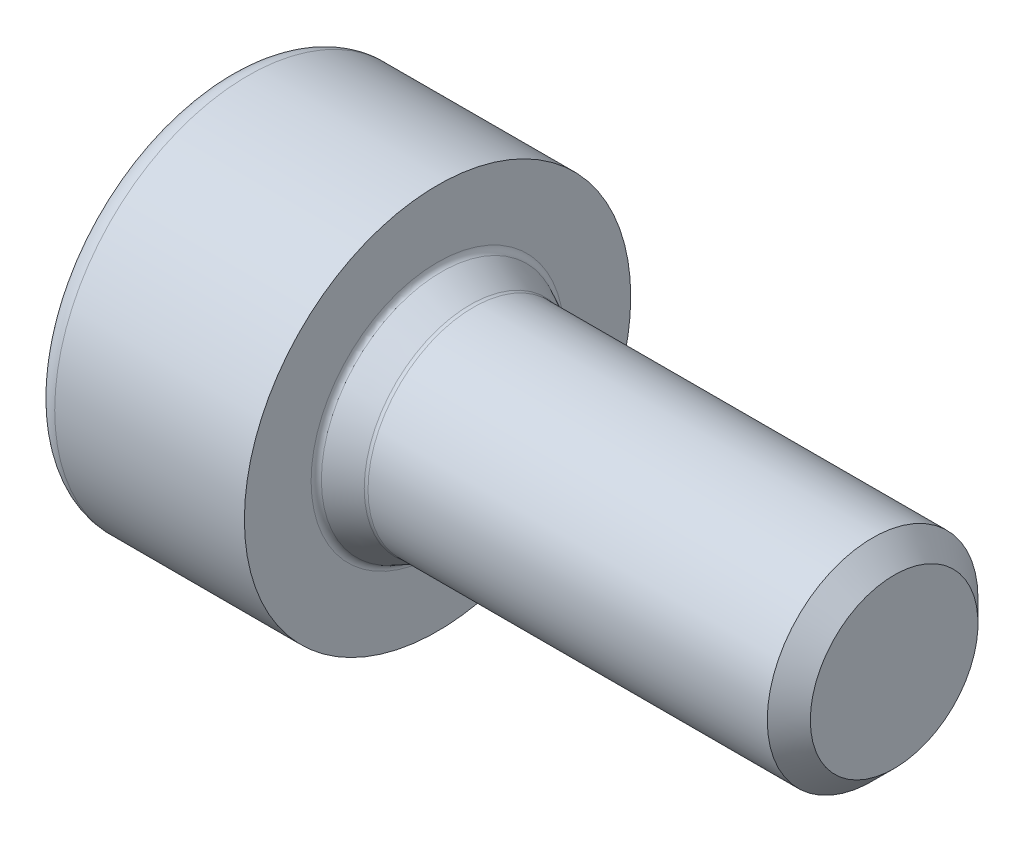
ISO-10303-21;
HEADER;
FILE_DESCRIPTION(('STEP AP214'),'2;1');
FILE_NAME('part.step','',(''),(''),'','','');
FILE_SCHEMA(('AUTOMOTIVE_DESIGN { 1 0 10303 214 1 1 1 1 }'));
ENDSEC;
DATA;
#1=APPLICATION_CONTEXT('core data for automotive mechanical design processes');
#2=APPLICATION_PROTOCOL_DEFINITION('international standard','automotive_design',2000,#1);
#3=PRODUCT_CONTEXT('',#1,'mechanical');
#4=PRODUCT('Part','Part','',(#3));
#5=PRODUCT_RELATED_PRODUCT_CATEGORY('part','',(#4));
#6=PRODUCT_DEFINITION_FORMATION('','',#4);
#7=PRODUCT_DEFINITION_CONTEXT('part definition',#1,'design');
#8=PRODUCT_DEFINITION('design','',#6,#7);
#9=PRODUCT_DEFINITION_SHAPE('','',#8);
#10=(LENGTH_UNIT() NAMED_UNIT(*) SI_UNIT(.MILLI.,.METRE.));
#11=(NAMED_UNIT(*) PLANE_ANGLE_UNIT() SI_UNIT($,.RADIAN.));
#12=(NAMED_UNIT(*) SI_UNIT($,.STERADIAN.) SOLID_ANGLE_UNIT());
#13=UNCERTAINTY_MEASURE_WITH_UNIT(LENGTH_MEASURE(1.E-05),#10,'distance_accuracy_value','');
#14=(GEOMETRIC_REPRESENTATION_CONTEXT(3) GLOBAL_UNCERTAINTY_ASSIGNED_CONTEXT((#13)) GLOBAL_UNIT_ASSIGNED_CONTEXT((#10,
#11,#12)) REPRESENTATION_CONTEXT('',''));
#15=CARTESIAN_POINT('',(0.,0.,0.));
#16=DIRECTION('',(0.,0.,1.));
#17=DIRECTION('',(1.,0.,0.));
#18=AXIS2_PLACEMENT_3D('',#15,#16,#17);
#19=CARTESIAN_POINT('',(-12.3555753520479,407.524390512293,-362.357299098567));
#20=DIRECTION('',(1.,0.,0.));
#21=DIRECTION('',(0.,0.,-1.));
#22=AXIS2_PLACEMENT_3D('',#19,#20,#21);
#23=PLANE('',#22);
#24=DIRECTION('',(0.,-0.001436357737181,0.999998968437693));
#25=VECTOR('',#24,1.);
#26=CARTESIAN_POINT('',(-12.355575352048,408.775425824748,-363.077190743416));
#27=LINE('',#26,#25);
#28=CARTESIAN_POINT('',(-12.3555753524209,408.774389222609,-362.355503651395));
#29=VERTEX_POINT('',#28);
#30=CARTESIAN_POINT('',(-12.3555753520479,408.775425824748,-363.077190743416));
#31=VERTEX_POINT('',#30);
#32=EDGE_CURVE('E164',#29,#31,#27,.F.);
#33=ORIENTED_EDGE('',*,*,#32,.T.);
#34=DIRECTION('',(0.,0.865306331556685,0.501243406508168));
#35=VECTOR('',#34,1.);
#36=CARTESIAN_POINT('',(-12.3555753520479,407.526463716109,-363.800673282609));
#37=LINE('',#36,#35);
#38=CARTESIAN_POINT('',(-12.3555753524207,408.150944770312,-363.438932012813));
#39=VERTEX_POINT('',#38);
#40=EDGE_CURVE('E160',#31,#39,#37,.F.);
#41=ORIENTED_EDGE('',*,*,#40,.T.);
#42=CARTESIAN_POINT('',(-12.3555753527938,407.524390512293,-362.357299098567));
#43=DIRECTION('',(-1.,0.,-2.16481306494449E-13));
#44=DIRECTION('',(-2.16481306494449E-13,0.,1.));
#45=AXIS2_PLACEMENT_3D('',#42,#43,#44);
#46=CIRCLE('',#45,1.24999999953735);
#47=EDGE_CURVE('E161',#39,#29,#46,.F.);
#48=ORIENTED_EDGE('',*,*,#47,.T.);
#49=EDGE_LOOP('',(#33,#41,#48));
#50=FACE_BOUND('',#49,.T.);
#51=ADVANCED_FACE('F17',(#50),#23,.F.);
#52=CARTESIAN_POINT('',(-12.3555753520479,407.524390512293,-362.357299098567));
#53=DIRECTION('',(1.,0.,0.));
#54=DIRECTION('',(0.,0.,-1.));
#55=AXIS2_PLACEMENT_3D('',#52,#53,#54);
#56=PLANE('',#55);
#57=DIRECTION('',(0.,-0.866742689293866,0.498755561929526));
#58=VECTOR('',#57,1.);
#59=CARTESIAN_POINT('',(-12.355575352048,408.773352620932,-361.633816559374));
#60=LINE('',#59,#58);
#61=CARTESIAN_POINT('',(-12.355575352421,408.147834964589,-361.27387073715));
#62=VERTEX_POINT('',#61);
#63=CARTESIAN_POINT('',(-12.355575352048,408.773352620932,-361.633816559374));
#64=VERTEX_POINT('',#63);
#65=EDGE_CURVE('E524',#62,#64,#60,.F.);
#66=ORIENTED_EDGE('',*,*,#65,.T.);
#67=DIRECTION('',(0.,-0.001436357737181,0.999998968437693));
#68=VECTOR('',#67,1.);
#69=CARTESIAN_POINT('',(-12.355575352048,408.775425824748,-363.077190743416));
#70=LINE('',#69,#68);
#71=EDGE_CURVE('E552',#64,#29,#70,.F.);
#72=ORIENTED_EDGE('',*,*,#71,.T.);
#73=CARTESIAN_POINT('',(-12.3555753527938,407.524390512293,-362.357299098567));
#74=DIRECTION('',(-1.,0.,-2.16481306494449E-13));
#75=DIRECTION('',(-2.16481306494449E-13,0.,1.));
#76=AXIS2_PLACEMENT_3D('',#73,#74,#75);
#77=CIRCLE('',#76,1.2499999995374);
#78=EDGE_CURVE('E179',#62,#29,#77,.T.);
#79=ORIENTED_EDGE('',*,*,#78,.F.);
#80=EDGE_LOOP('',(#66,#72,#79));
#81=FACE_BOUND('',#80,.T.);
#82=ADVANCED_FACE('F756',(#81),#56,.F.);
#83=CARTESIAN_POINT('',(-12.3555753520479,408.775425824748,-363.077190743416));
#84=DIRECTION('',(0.,0.999998968437693,0.001436357737181));
#85=DIRECTION('',(0.,-0.001436357737181,0.999998968437693));
#86=AXIS2_PLACEMENT_3D('',#83,#84,#85);
#87=PLANE('',#86);
#88=DIRECTION('',(0.,-0.001436357737181,0.999998968437693));
#89=VECTOR('',#88,1.);
#90=CARTESIAN_POINT('',(-14.2055753520479,408.775425824748,-363.077190743416));
#91=LINE('',#90,#89);
#92=CARTESIAN_POINT('',(-14.2055753520479,408.775425824748,-363.077190743416));
#93=VERTEX_POINT('',#92);
#94=CARTESIAN_POINT('',(-14.205575352099,408.77540154939,-363.060290126061));
#95=VERTEX_POINT('',#94);
#96=EDGE_CURVE('E428',#93,#95,#91,.T.);
#97=ORIENTED_EDGE('',*,*,#96,.F.);
#98=DIRECTION('',(1.,0.,0.));
#99=VECTOR('',#98,1.);
#100=CARTESIAN_POINT('',(-12.3555753520479,408.775425824748,-363.077190743417));
#101=LINE('',#100,#99);
#102=EDGE_CURVE('E169',#93,#31,#101,.T.);
#103=ORIENTED_EDGE('',*,*,#102,.T.);
#104=ORIENTED_EDGE('',*,*,#32,.F.);
#105=ORIENTED_EDGE('',*,*,#71,.F.);
#106=DIRECTION('',(1.,0.,0.));
#107=VECTOR('',#106,1.);
#108=CARTESIAN_POINT('',(-12.355575352048,408.773352620932,-361.633816559374));
#109=LINE('',#108,#107);
#110=CARTESIAN_POINT('',(-14.2055753520479,408.773352620932,-361.633816559374));
#111=VERTEX_POINT('',#110);
#112=EDGE_CURVE('E514',#64,#111,#109,.F.);
#113=ORIENTED_EDGE('',*,*,#112,.T.);
#114=DIRECTION('',(0.,-0.001436357737181,0.999998968437693));
#115=VECTOR('',#114,1.);
#116=CARTESIAN_POINT('',(-14.2055753520478,408.775425824748,-363.077190743416));
#117=LINE('',#116,#115);
#118=CARTESIAN_POINT('',(-14.2055753521657,408.77337689629,-361.650717176594));
#119=VERTEX_POINT('',#118);
#120=EDGE_CURVE('E182',#119,#111,#117,.T.);
#121=ORIENTED_EDGE('',*,*,#120,.F.);
#122=CARTESIAN_POINT('',(-14.2055753521713,408.775401549413,-363.060290126233));
#123=CARTESIAN_POINT('',(-14.1818605668288,408.775332139449,-363.011966594605));
#124=CARTESIAN_POINT('',(-14.1595698837865,408.775261589849,-362.962849637471));
#125=CARTESIAN_POINT('',(-14.1187835332441,408.775117785222,-362.862732187342));
#126=CARTESIAN_POINT('',(-14.1003115832626,408.775044516436,-362.811722115235));
#127=CARTESIAN_POINT('',(-14.068482341237,408.774895967497,-362.708301649208));
#128=CARTESIAN_POINT('',(-14.0551059144334,408.774820696028,-362.655897300804));
#129=CARTESIAN_POINT('',(-14.0345556307625,408.774668576383,-362.549990893299));
#130=CARTESIAN_POINT('',(-14.0273635917321,408.774591733514,-362.49649252872));
#131=CARTESIAN_POINT('',(-14.0226061400785,408.774493727523,-362.42826029993));
#132=CARTESIAN_POINT('',(-14.021845453552,408.774472836964,-362.413716195228));
#133=CARTESIAN_POINT('',(-14.0208299372647,408.774431039519,-362.384616618899));
#134=CARTESIAN_POINT('',(-14.0205748780482,408.774410132645,-362.370061155427));
#135=CARTESIAN_POINT('',(-14.02057658657,408.774334730605,-362.317565902896));
#136=CARTESIAN_POINT('',(-14.0223132879634,408.774280218465,-362.279614295819));
#137=CARTESIAN_POINT('',(-14.0291569958457,408.774171619546,-362.20400722139));
#138=CARTESIAN_POINT('',(-14.0342663783348,408.774117533096,-362.166351981762));
#139=CARTESIAN_POINT('',(-14.054330819617,408.773956017387,-362.053903990394));
#140=CARTESIAN_POINT('',(-14.0740189447518,408.773849763539,-361.979929564883));
#141=CARTESIAN_POINT('',(-14.1132845540777,408.773682446437,-361.863442616683));
#142=CARTESIAN_POINT('',(-14.1299375139902,408.773619853772,-361.819865310994));
#143=CARTESIAN_POINT('',(-14.1659144314126,408.773496893351,-361.73425969142));
#144=CARTESIAN_POINT('',(-14.1852142365639,408.77343651111,-361.692221292679));
#145=CARTESIAN_POINT('',(-14.205575352182,408.77337689629,-361.650717176561));
#146=B_SPLINE_CURVE_WITH_KNOTS('',3,(#122,#123,#124,#125,#126,#127,#128,#129,#130,#131,#132,
#133,#134,#135,#136,#137,#138,#139,#140,#141,#142,#143,#144,#145),.UNSPECIFIED.,.F.,.F.,(4,2,2,
2,2,2,2,2,2,2,2,4),(0.,0.161592976161006,0.324161275105769,0.486112932388837,0.647586806093457,
0.691272786497746,0.734938937486733,0.848735605551864,0.962612527238233,1.1912562517991,
1.33113310606137,1.46980937846824),.UNSPECIFIED.);
#147=EDGE_CURVE('E423',#95,#119,#146,.T.);
#148=ORIENTED_EDGE('',*,*,#147,.F.);
#149=EDGE_LOOP('',(#97,#103,#104,#105,#113,#121,#148));
#150=FACE_BOUND('',#149,.T.);
#151=ADVANCED_FACE('F414',(#150),#87,.F.);
#152=CARTESIAN_POINT('',(-12.3555753520479,407.526463716109,-363.800673282609));
#153=DIRECTION('',(0.,0.501243406508168,-0.865306331556685));
#154=DIRECTION('',(0.,0.865306331556685,0.501243406508168));
#155=AXIS2_PLACEMENT_3D('',#152,#153,#154);
#156=PLANE('',#155);
#157=DIRECTION('',(1.,0.,0.));
#158=VECTOR('',#157,1.);
#159=CARTESIAN_POINT('',(-12.355575352048,407.526463716109,-363.800673282609));
#160=LINE('',#159,#158);
#161=CARTESIAN_POINT('',(-14.2055753520479,407.526463716109,-363.800673282609));
#162=VERTEX_POINT('',#161);
#163=CARTESIAN_POINT('',(-12.3555753520479,407.526463716109,-363.800673282609));
#164=VERTEX_POINT('',#163);
#165=EDGE_CURVE('E174',#162,#164,#160,.T.);
#166=ORIENTED_EDGE('',*,*,#165,.T.);
#167=DIRECTION('',(0.,0.865306331556624,0.501243406508274));
#168=VECTOR('',#167,1.);
#169=CARTESIAN_POINT('',(-12.3555753520479,407.526463716109,-363.800673282609));
#170=LINE('',#169,#168);
#171=EDGE_CURVE('E148',#164,#39,#170,.T.);
#172=ORIENTED_EDGE('',*,*,#171,.T.);
#173=ORIENTED_EDGE('',*,*,#40,.F.);
#174=ORIENTED_EDGE('',*,*,#102,.F.);
#175=DIRECTION('',(0.,0.865306331556685,0.501243406508168));
#176=VECTOR('',#175,1.);
#177=CARTESIAN_POINT('',(-14.2055753520479,407.526463716109,-363.800673282609));
#178=LINE('',#177,#176);
#179=CARTESIAN_POINT('',(-14.2055753521656,408.760801598575,-363.085662075102));
#180=VERTEX_POINT('',#179);
#181=EDGE_CURVE('E422',#180,#93,#178,.T.);
#182=ORIENTED_EDGE('',*,*,#181,.F.);
#183=CARTESIAN_POINT('',(-14.2055753521713,407.541087942261,-363.792201950961));
#184=CARTESIAN_POINT('',(-14.1818605668282,407.582902643271,-363.767980074354));
#185=CARTESIAN_POINT('',(-14.1595698837854,407.625403901106,-363.743360498041));
#186=CARTESIAN_POINT('',(-14.1187835332425,407.712036253968,-363.693177234515));
#187=CARTESIAN_POINT('',(-14.1003115832609,407.756175637869,-363.667608745831));
#188=CARTESIAN_POINT('',(-14.0684823412355,407.845666114251,-363.615769865664));
#189=CARTESIAN_POINT('',(-14.055105914432,407.891011975502,-363.589502504458));
#190=CARTESIAN_POINT('',(-14.0345556307625,407.982653555001,-363.536417561227));
#191=CARTESIAN_POINT('',(-14.0273635917332,408.02894607635,-363.50960183106));
#192=CARTESIAN_POINT('',(-14.0226061400779,408.087987916845,-363.475400840991));
#193=CARTESIAN_POINT('',(-14.0218454535508,408.100573035713,-363.468110696887));
#194=CARTESIAN_POINT('',(-14.0208299372654,408.125753109329,-363.453524711069));
#195=CARTESIAN_POINT('',(-14.0205748780513,408.13834805702,-363.446228873444));
#196=CARTESIAN_POINT('',(-14.0205765865773,408.183772578265,-363.419915947088));
#197=CARTESIAN_POINT('',(-14.0223132879652,408.216612378045,-363.400892934662));
#198=CARTESIAN_POINT('',(-14.0291569958435,408.282035725752,-363.362995348034));
#199=CARTESIAN_POINT('',(-14.0342663783339,408.314619076628,-363.344120887977));
#200=CARTESIAN_POINT('',(-14.0543308196182,408.4119211359,-363.287757015582));
#201=CARTESIAN_POINT('',(-14.0740189447517,408.4759317407,-363.250677784297));
#202=CARTESIAN_POINT('',(-14.1132845540769,408.5767287385,-363.192289409337));
#203=CARTESIAN_POINT('',(-14.1299375139895,408.614436495922,-363.170446549655));
#204=CARTESIAN_POINT('',(-14.1659144314122,408.68851165697,-363.127537253019));
#205=CARTESIAN_POINT('',(-14.1852142365639,408.724887787094,-363.106465761093));
#206=CARTESIAN_POINT('',(-14.205575352182,408.760801598604,-363.085662075086));
#207=B_SPLINE_CURVE_WITH_KNOTS('',3,(#183,#184,#185,#186,#187,#188,#189,#190,#191,#192,#193,
#194,#195,#196,#197,#198,#199,#200,#201,#202,#203,#204,#205,#206),.UNSPECIFIED.,.F.,.F.,(4,2,2,
2,2,2,2,2,2,2,2,4),(0.,0.161592976164444,0.324161275111491,0.48611293239164,0.64758680609382,
0.69127278649784,0.734938937486526,0.848735605552501,0.962612527238676,1.19125625179824,
1.33113310606072,1.46980937846929),.UNSPECIFIED.);
#208=CARTESIAN_POINT('',(-14.2055753520988,407.541087942399,-363.792201950855));
#209=VERTEX_POINT('',#208);
#210=EDGE_CURVE('E417',#209,#180,#207,.T.);
#211=ORIENTED_EDGE('',*,*,#210,.F.);
#212=DIRECTION('',(0.,0.865306331556685,0.501243406508168));
#213=VECTOR('',#212,1.);
#214=CARTESIAN_POINT('',(-14.2055753520478,407.526463716109,-363.800673282609));
#215=LINE('',#214,#213);
#216=EDGE_CURVE('E168',#162,#209,#215,.T.);
#217=ORIENTED_EDGE('',*,*,#216,.F.);
#218=EDGE_LOOP('',(#166,#172,#173,#174,#182,#211,#217));
#219=FACE_BOUND('',#218,.T.);
#220=ADVANCED_FACE('F171',(#219),#156,.F.);
#221=CARTESIAN_POINT('',(-12.3555753520479,407.524390512293,-362.357299098567));
#222=DIRECTION('',(1.,0.,0.));
#223=DIRECTION('',(0.,0.,-1.));
#224=AXIS2_PLACEMENT_3D('',#221,#222,#223);
#225=PLANE('',#224);
#226=ORIENTED_EDGE('',*,*,#171,.F.);
#227=DIRECTION('',(0.,0.866742689293866,-0.498755561929526));
#228=VECTOR('',#227,1.);
#229=CARTESIAN_POINT('',(-12.3555753520479,406.275428403654,-363.080781637759));
#230=LINE('',#229,#228);
#231=CARTESIAN_POINT('',(-12.3555753524207,406.900946059996,-363.440727459983));
#232=VERTEX_POINT('',#231);
#233=EDGE_CURVE('E150',#164,#232,#230,.F.);
#234=ORIENTED_EDGE('',*,*,#233,.T.);
#235=CARTESIAN_POINT('',(-12.3555753527938,407.524390512293,-362.357299098567));
#236=DIRECTION('',(-1.,0.,-2.16481306494449E-13));
#237=DIRECTION('',(-2.16481306494449E-13,0.,1.));
#238=AXIS2_PLACEMENT_3D('',#235,#236,#237);
#239=CIRCLE('',#238,1.24999999953734);
#240=EDGE_CURVE('E144',#232,#39,#239,.F.);
#241=ORIENTED_EDGE('',*,*,#240,.T.);
#242=EDGE_LOOP('',(#226,#234,#241));
#243=FACE_BOUND('',#242,.T.);
#244=ADVANCED_FACE('F146',(#243),#225,.F.);
#245=CARTESIAN_POINT('',(-12.3555753527282,407.524390512293,-362.357299098567));
#246=DIRECTION('',(-1.,0.,-2.16481306494449E-13));
#247=DIRECTION('',(-2.16481306494449E-13,0.,1.));
#248=AXIS2_PLACEMENT_3D('',#245,#246,#247);
#249=CONICAL_SURFACE('',#248,1.24999999942377,1.04719754973717);
#250=CARTESIAN_POINT('',(-12.3555753527938,407.524390512293,-362.357299098567));
#251=DIRECTION('',(-1.,0.,-2.16481306494449E-13));
#252=DIRECTION('',(-2.16481306494449E-13,0.,1.));
#253=AXIS2_PLACEMENT_3D('',#250,#251,#252);
#254=CIRCLE('',#253,1.24999999953746);
#255=CARTESIAN_POINT('',(-12.355575352421,406.897836254274,-361.275666184321));
#256=VERTEX_POINT('',#255);
#257=EDGE_CURVE('E155',#256,#62,#254,.T.);
#258=ORIENTED_EDGE('',*,*,#257,.T.);
#259=ORIENTED_EDGE('',*,*,#78,.T.);
#260=ORIENTED_EDGE('',*,*,#47,.F.);
#261=ORIENTED_EDGE('',*,*,#240,.F.);
#262=CARTESIAN_POINT('',(-12.3555753527938,407.524390512293,-362.357299098567));
#263=DIRECTION('',(-1.,0.,-2.16481306494449E-13));
#264=DIRECTION('',(-2.16481306494449E-13,0.,1.));
#265=AXIS2_PLACEMENT_3D('',#262,#263,#264);
#266=CIRCLE('',#265,1.2499999995374);
#267=CARTESIAN_POINT('',(-12.3555753524209,406.274391801977,-362.359094545738));
#268=VERTEX_POINT('',#267);
#269=EDGE_CURVE('E382',#232,#268,#266,.T.);
#270=ORIENTED_EDGE('',*,*,#269,.T.);
#271=CARTESIAN_POINT('',(-12.3555753527938,407.524390512293,-362.357299098567));
#272=DIRECTION('',(-1.,0.,-2.16481306494449E-13));
#273=DIRECTION('',(-2.16481306494449E-13,0.,1.));
#274=AXIS2_PLACEMENT_3D('',#271,#272,#273);
#275=CIRCLE('',#274,1.24999999953742);
#276=EDGE_CURVE('E793',#268,#256,#275,.T.);
#277=ORIENTED_EDGE('',*,*,#276,.T.);
#278=EDGE_LOOP('',(#258,#259,#260,#261,#270,#277));
#279=FACE_BOUND('',#278,.T.);
#280=CARTESIAN_POINT('',(-11.633887514364,407.524390512293,-362.357299098624));
#281=VERTEX_POINT('',#280);
#282=VERTEX_LOOP('',#281);
#283=FACE_BOUND('',#282,.T.);
#284=ADVANCED_FACE('F176',(#279,#283),#249,.F.);
#285=CARTESIAN_POINT('',(-12.3555753520479,407.524390512293,-362.357299098567));
#286=DIRECTION('',(1.,0.,0.));
#287=DIRECTION('',(0.,0.,-1.));
#288=AXIS2_PLACEMENT_3D('',#285,#286,#287);
#289=PLANE('',#288);
#290=DIRECTION('',(0.,-0.865306331556685,-0.501243406508168));
#291=VECTOR('',#290,1.);
#292=CARTESIAN_POINT('',(-12.3555753520479,407.522317308478,-360.913924914525));
#293=LINE('',#292,#291);
#294=CARTESIAN_POINT('',(-12.3555753520479,407.522317308478,-360.913924914525));
#295=VERTEX_POINT('',#294);
#296=EDGE_CURVE('E509',#256,#295,#293,.F.);
#297=ORIENTED_EDGE('',*,*,#296,.T.);
#298=DIRECTION('',(0.,-0.866742689293866,0.498755561929526));
#299=VECTOR('',#298,1.);
#300=CARTESIAN_POINT('',(-12.355575352048,408.773352620932,-361.633816559374));
#301=LINE('',#300,#299);
#302=EDGE_CURVE('E519',#295,#62,#301,.F.);
#303=ORIENTED_EDGE('',*,*,#302,.T.);
#304=ORIENTED_EDGE('',*,*,#257,.F.);
#305=EDGE_LOOP('',(#297,#303,#304));
#306=FACE_BOUND('',#305,.T.);
#307=ADVANCED_FACE('F402',(#306),#289,.F.);
#308=CARTESIAN_POINT('',(-12.355575352048,408.773352620932,-361.633816559374));
#309=DIRECTION('',(0.,0.498755561929526,0.866742689293866));
#310=DIRECTION('',(0.,-0.866742689293866,0.498755561929526));
#311=AXIS2_PLACEMENT_3D('',#308,#309,#310);
#312=PLANE('',#311);
#313=ORIENTED_EDGE('',*,*,#112,.F.);
#314=ORIENTED_EDGE('',*,*,#65,.F.);
#315=ORIENTED_EDGE('',*,*,#302,.F.);
#316=DIRECTION('',(1.,0.,0.));
#317=VECTOR('',#316,1.);
#318=CARTESIAN_POINT('',(-12.355575352048,407.522317308478,-360.913924914525));
#319=LINE('',#318,#317);
#320=CARTESIAN_POINT('',(-14.2055753520479,407.522317308478,-360.913924914525));
#321=VERTEX_POINT('',#320);
#322=EDGE_CURVE('E505',#295,#321,#319,.F.);
#323=ORIENTED_EDGE('',*,*,#322,.T.);
#324=DIRECTION('',(0.,-0.866742689293866,0.498755561929526));
#325=VECTOR('',#324,1.);
#326=CARTESIAN_POINT('',(-14.2055753520479,408.773352620932,-361.633816559374));
#327=LINE('',#326,#325);
#328=CARTESIAN_POINT('',(-14.205575352166,407.536965810008,-360.922354200058));
#329=VERTEX_POINT('',#328);
#330=EDGE_CURVE('E517',#329,#321,#327,.T.);
#331=ORIENTED_EDGE('',*,*,#330,.F.);
#332=CARTESIAN_POINT('',(-14.2055753521718,408.758704119445,-361.625387273839));
#333=CARTESIAN_POINT('',(-14.1818605668287,408.716820008471,-361.601285618817));
#334=CARTESIAN_POINT('',(-14.1595698837859,408.674248201035,-361.576788237996));
#335=CARTESIAN_POINT('',(-14.1187835332431,408.587472043546,-361.52685405139));
#336=CARTESIAN_POINT('',(-14.1003115832615,408.543259390859,-361.501412467966));
#337=CARTESIAN_POINT('',(-14.0684823412361,408.45362036554,-361.449830882107));
#338=CARTESIAN_POINT('',(-14.0551059144326,408.40819923282,-361.42369389491));
#339=CARTESIAN_POINT('',(-14.0345556307631,408.316405533674,-361.370872430636));
#340=CARTESIAN_POINT('',(-14.0273635917338,408.270036169454,-361.344189796226));
#341=CARTESIAN_POINT('',(-14.0226061400785,408.210896322972,-361.310158557506));
#342=CARTESIAN_POINT('',(-14.0218454535514,408.198290313546,-361.302904596908));
#343=CARTESIAN_POINT('',(-14.020829937266,408.173068442481,-361.288391006396));
#344=CARTESIAN_POINT('',(-14.0205748780519,408.160452587911,-361.28113138055));
#345=CARTESIAN_POINT('',(-14.0205765865779,408.114952664615,-361.254949054375));
#346=CARTESIAN_POINT('',(-14.0223132879658,408.082058352708,-361.236020459723));
#347=CARTESIAN_POINT('',(-14.0291569958442,408.016526406092,-361.198310971922));
#348=CARTESIAN_POINT('',(-14.0342663783346,407.983888968762,-361.179530192351));
#349=CARTESIAN_POINT('',(-14.0543308196189,407.886425393776,-361.123446073379));
#350=CARTESIAN_POINT('',(-14.0740189447525,407.822308535131,-361.086550879153));
#351=CARTESIAN_POINT('',(-14.1132845540777,407.72134422023,-361.028452305913));
#352=CARTESIAN_POINT('',(-14.1299375139902,407.683573870143,-361.006717859907));
#353=CARTESIAN_POINT('',(-14.1659144314127,407.609375748674,-360.964021536968));
#354=CARTESIAN_POINT('',(-14.1852142365643,407.572939236309,-360.943054630153));
#355=CARTESIAN_POINT('',(-14.2055753521823,407.53696580998,-360.922354200042));
#356=B_SPLINE_CURVE_WITH_KNOTS('',3,(#332,#333,#334,#335,#336,#337,#338,#339,#340,#341,#342,
#343,#344,#345,#346,#347,#348,#349,#350,#351,#352,#353,#354,#355),.UNSPECIFIED.,.F.,.F.,(4,2,2,
2,2,2,2,2,2,2,2,4),(0.,0.161592976164487,0.324161275111402,0.486112932391444,0.647586806093573,
0.691272786497742,0.734938937486809,0.848735605552765,0.962612527238996,1.19125625179859,
1.33113310606034,1.46980937846816),.UNSPECIFIED.);
#357=CARTESIAN_POINT('',(-14.2055753520991,408.758704119284,-361.625387273773));
#358=VERTEX_POINT('',#357);
#359=EDGE_CURVE('E383',#358,#329,#356,.T.);
#360=ORIENTED_EDGE('',*,*,#359,.F.);
#361=DIRECTION('',(0.,-0.866742689293866,0.498755561929526));
#362=VECTOR('',#361,1.);
#363=CARTESIAN_POINT('',(-14.2055753520479,408.773352620932,-361.633816559374));
#364=LINE('',#363,#362);
#365=EDGE_CURVE('E381',#111,#358,#364,.T.);
#366=ORIENTED_EDGE('',*,*,#365,.F.);
#367=EDGE_LOOP('',(#313,#314,#315,#323,#331,#360,#366));
#368=FACE_BOUND('',#367,.T.);
#369=ADVANCED_FACE('F396',(#368),#312,.F.);
#370=CARTESIAN_POINT('',(-12.355575352048,406.275428403654,-363.080781637759));
#371=DIRECTION('',(0.,-0.498755561929526,-0.866742689293866));
#372=DIRECTION('',(0.,0.866742689293866,-0.498755561929526));
#373=AXIS2_PLACEMENT_3D('',#370,#371,#372);
#374=PLANE('',#373);
#375=DIRECTION('',(1.,0.,0.));
#376=VECTOR('',#375,1.);
#377=CARTESIAN_POINT('',(-12.3555753520479,406.275428403654,-363.080781637759));
#378=LINE('',#377,#376);
#379=CARTESIAN_POINT('',(-14.2055753520479,406.275428403654,-363.080781637759));
#380=VERTEX_POINT('',#379);
#381=CARTESIAN_POINT('',(-12.355575352048,406.275428403654,-363.080781637759));
#382=VERTEX_POINT('',#381);
#383=EDGE_CURVE('E802',#380,#382,#378,.T.);
#384=ORIENTED_EDGE('',*,*,#383,.T.);
#385=DIRECTION('',(0.,0.866742689293571,-0.498755561930039));
#386=VECTOR('',#385,1.);
#387=CARTESIAN_POINT('',(-12.3555753520479,406.275428403654,-363.080781637759));
#388=LINE('',#387,#386);
#389=EDGE_CURVE('E823',#382,#232,#388,.T.);
#390=ORIENTED_EDGE('',*,*,#389,.T.);
#391=ORIENTED_EDGE('',*,*,#233,.F.);
#392=ORIENTED_EDGE('',*,*,#165,.F.);
#393=DIRECTION('',(0.,0.866742689293866,-0.498755561929526));
#394=VECTOR('',#393,1.);
#395=CARTESIAN_POINT('',(-14.205575352048,406.275428403654,-363.080781637759));
#396=LINE('',#395,#394);
#397=CARTESIAN_POINT('',(-14.2055753521651,407.511815214579,-363.792243997075));
#398=VERTEX_POINT('',#397);
#399=EDGE_CURVE('E380',#398,#162,#396,.T.);
#400=ORIENTED_EDGE('',*,*,#399,.F.);
#401=CARTESIAN_POINT('',(-14.2055753521711,406.290076905141,-363.089210923293));
#402=CARTESIAN_POINT('',(-14.181860566828,406.331961016115,-363.113312578316));
#403=CARTESIAN_POINT('',(-14.1595698837851,406.37453282355,-363.137809959137));
#404=CARTESIAN_POINT('',(-14.1187835332422,406.46130898104,-363.187744145743));
#405=CARTESIAN_POINT('',(-14.1003115832605,406.505521633727,-363.213185729167));
#406=CARTESIAN_POINT('',(-14.068482341235,406.595160659046,-363.264767315026));
#407=CARTESIAN_POINT('',(-14.0551059144314,406.640581791766,-363.290904302224));
#408=CARTESIAN_POINT('',(-14.0345556307618,406.732375490912,-363.343725766497));
#409=CARTESIAN_POINT('',(-14.0273635917324,406.778744855133,-363.370408400907));
#410=CARTESIAN_POINT('',(-14.0226061400771,406.837884701614,-363.404439639627));
#411=CARTESIAN_POINT('',(-14.02184545355,406.85049071104,-363.411693600225));
#412=CARTESIAN_POINT('',(-14.0208299372646,406.875712582105,-363.426207190737));
#413=CARTESIAN_POINT('',(-14.0205748780505,406.888328436676,-363.433466816583));
#414=CARTESIAN_POINT('',(-14.0205765865765,406.933828359971,-363.459649142758));
#415=CARTESIAN_POINT('',(-14.0223132879644,406.966722671878,-363.47857773741));
#416=CARTESIAN_POINT('',(-14.0291569958427,407.032254618494,-363.516287225211));
#417=CARTESIAN_POINT('',(-14.0342663783331,407.064892055824,-363.535068004782));
#418=CARTESIAN_POINT('',(-14.0543308196173,407.162355630809,-363.591152123753));
#419=CARTESIAN_POINT('',(-14.0740189447508,407.226472489455,-363.62804731798));
#420=CARTESIAN_POINT('',(-14.113284554076,407.327436804356,-363.68614589122));
#421=CARTESIAN_POINT('',(-14.1299375139886,407.365207154443,-363.707880337226));
#422=CARTESIAN_POINT('',(-14.1659144314113,407.439405275912,-363.750576660165));
#423=CARTESIAN_POINT('',(-14.1852142365629,407.475841788278,-363.771543566981));
#424=CARTESIAN_POINT('',(-14.2055753521811,407.511815214608,-363.792243997092));
#425=B_SPLINE_CURVE_WITH_KNOTS('',3,(#401,#402,#403,#404,#405,#406,#407,#408,#409,#410,#411,
#412,#413,#414,#415,#416,#417,#418,#419,#420,#421,#422,#423,#424),.UNSPECIFIED.,.F.,.F.,(4,2,2,
2,2,2,2,2,2,2,2,4),(0.,0.161592976164672,0.324161275111894,0.486112932392167,0.647586806094556,
0.691272786498678,0.734938937487366,0.848735605553297,0.962612527239342,1.19125625179877,
1.33113310606137,1.46980937846995),.UNSPECIFIED.);
#426=CARTESIAN_POINT('',(-14.2055753520989,406.290076905301,-363.08921092336));
#427=VERTEX_POINT('',#426);
#428=EDGE_CURVE('E372',#427,#398,#425,.T.);
#429=ORIENTED_EDGE('',*,*,#428,.F.);
#430=DIRECTION('',(0.,0.866742689293866,-0.498755561929526));
#431=VECTOR('',#430,1.);
#432=CARTESIAN_POINT('',(-14.2055753520479,406.275428403654,-363.080781637759));
#433=LINE('',#432,#431);
#434=EDGE_CURVE('E496',#380,#427,#433,.T.);
#435=ORIENTED_EDGE('',*,*,#434,.F.);
#436=EDGE_LOOP('',(#384,#390,#391,#392,#400,#429,#435));
#437=FACE_BOUND('',#436,.T.);
#438=ADVANCED_FACE('F391',(#437),#374,.F.);
#439=CARTESIAN_POINT('',(-12.3555753520479,407.524390512293,-362.357299098567));
#440=DIRECTION('',(1.,0.,0.));
#441=DIRECTION('',(0.,0.,-1.));
#442=AXIS2_PLACEMENT_3D('',#439,#440,#441);
#443=PLANE('',#442);
#444=ORIENTED_EDGE('',*,*,#389,.F.);
#445=DIRECTION('',(0.,0.001436357737181,-0.999998968437693));
#446=VECTOR('',#445,1.);
#447=CARTESIAN_POINT('',(-12.355575352048,406.273355199838,-361.637407453717));
#448=LINE('',#447,#446);
#449=EDGE_CURVE('E816',#382,#268,#448,.F.);
#450=ORIENTED_EDGE('',*,*,#449,.T.);
#451=ORIENTED_EDGE('',*,*,#269,.F.);
#452=EDGE_LOOP('',(#444,#450,#451));
#453=FACE_BOUND('',#452,.T.);
#454=ADVANCED_FACE('F395',(#453),#443,.F.);
#455=CARTESIAN_POINT('',(-12.3555753520479,407.524390512293,-362.357299098567));
#456=DIRECTION('',(1.,0.,0.));
#457=DIRECTION('',(0.,0.,-1.));
#458=AXIS2_PLACEMENT_3D('',#455,#456,#457);
#459=PLANE('',#458);
#460=DIRECTION('',(0.,0.001436357737181,-0.999998968437693));
#461=VECTOR('',#460,1.);
#462=CARTESIAN_POINT('',(-12.355575352048,406.273355199838,-361.637407453717));
#463=LINE('',#462,#461);
#464=CARTESIAN_POINT('',(-12.355575352048,406.273355199838,-361.637407453717));
#465=VERTEX_POINT('',#464);
#466=EDGE_CURVE('E339',#268,#465,#463,.F.);
#467=ORIENTED_EDGE('',*,*,#466,.T.);
#468=DIRECTION('',(0.,-0.865306331556685,-0.501243406508168));
#469=VECTOR('',#468,1.);
#470=CARTESIAN_POINT('',(-12.3555753520479,407.522317308478,-360.913924914525));
#471=LINE('',#470,#469);
#472=EDGE_CURVE('E528',#465,#256,#471,.F.);
#473=ORIENTED_EDGE('',*,*,#472,.T.);
#474=ORIENTED_EDGE('',*,*,#276,.F.);
#475=EDGE_LOOP('',(#467,#473,#474));
#476=FACE_BOUND('',#475,.T.);
#477=ADVANCED_FACE('F704',(#476),#459,.F.);
#478=CARTESIAN_POINT('',(-12.355575352048,407.522317308478,-360.913924914525));
#479=DIRECTION('',(0.,-0.501243406508168,0.865306331556685));
#480=DIRECTION('',(0.,-0.865306331556685,-0.501243406508168));
#481=AXIS2_PLACEMENT_3D('',#478,#479,#480);
#482=PLANE('',#481);
#483=ORIENTED_EDGE('',*,*,#322,.F.);
#484=ORIENTED_EDGE('',*,*,#296,.F.);
#485=ORIENTED_EDGE('',*,*,#472,.F.);
#486=DIRECTION('',(1.,0.,0.));
#487=VECTOR('',#486,1.);
#488=CARTESIAN_POINT('',(-12.3555753520479,406.273355199838,-361.637407453717));
#489=LINE('',#488,#487);
#490=CARTESIAN_POINT('',(-14.2055753520479,406.273355199838,-361.637407453717));
#491=VERTEX_POINT('',#490);
#492=EDGE_CURVE('E333',#465,#491,#489,.F.);
#493=ORIENTED_EDGE('',*,*,#492,.T.);
#494=DIRECTION('',(0.,-0.865306331556685,-0.501243406508168));
#495=VECTOR('',#494,1.);
#496=CARTESIAN_POINT('',(-14.2055753520478,407.522317308478,-360.913924914525));
#497=LINE('',#496,#495);
#498=CARTESIAN_POINT('',(-14.2055753521657,406.287979426011,-361.628936122032));
#499=VERTEX_POINT('',#498);
#500=EDGE_CURVE('E808',#499,#491,#497,.T.);
#501=ORIENTED_EDGE('',*,*,#500,.F.);
#502=CARTESIAN_POINT('',(-14.2055753521718,407.507693082326,-360.922396246173));
#503=CARTESIAN_POINT('',(-14.1818605668287,407.465878381316,-360.94661812278));
#504=CARTESIAN_POINT('',(-14.1595698837858,407.423377123481,-360.971237699094));
#505=CARTESIAN_POINT('',(-14.1187835332429,407.336744770619,-361.021420962619));
#506=CARTESIAN_POINT('',(-14.1003115832612,407.292605386717,-361.046989451303));
#507=CARTESIAN_POINT('',(-14.0684823412357,407.203114910336,-361.098828331471));
#508=CARTESIAN_POINT('',(-14.0551059144322,407.157769049084,-361.125095692676));
#509=CARTESIAN_POINT('',(-14.0345556307625,407.066127469586,-361.178180635907));
#510=CARTESIAN_POINT('',(-14.0273635917332,407.019834948236,-361.204996366075));
#511=CARTESIAN_POINT('',(-14.0226061400779,406.960793107742,-361.239197356143));
#512=CARTESIAN_POINT('',(-14.0218454535508,406.948207988873,-361.246487500248));
#513=CARTESIAN_POINT('',(-14.0208299372653,406.923027915257,-361.261073486065));
#514=CARTESIAN_POINT('',(-14.0205748780513,406.910432967567,-361.26836932369));
#515=CARTESIAN_POINT('',(-14.0205765865772,406.865008446322,-361.294682250046));
#516=CARTESIAN_POINT('',(-14.0223132879651,406.832168646542,-361.313705262473));
#517=CARTESIAN_POINT('',(-14.0291569958434,406.766745298834,-361.351602849101));
#518=CARTESIAN_POINT('',(-14.0342663783338,406.734161947958,-361.370477309158));
#519=CARTESIAN_POINT('',(-14.054330819618,406.636859888687,-361.426841181553));
#520=CARTESIAN_POINT('',(-14.0740189447515,406.572849283887,-361.463920412838));
#521=CARTESIAN_POINT('',(-14.1132845540767,406.472052286087,-361.522308787797));
#522=CARTESIAN_POINT('',(-14.1299375139893,406.434344528664,-361.54415164748));
#523=CARTESIAN_POINT('',(-14.165914431412,406.360269367617,-361.587060944115));
#524=CARTESIAN_POINT('',(-14.1852142365636,406.323893237493,-361.608132436042));
#525=CARTESIAN_POINT('',(-14.2055753521818,406.287979425983,-361.628936122049));
#526=B_SPLINE_CURVE_WITH_KNOTS('',3,(#502,#503,#504,#505,#506,#507,#508,#509,#510,#511,#512,
#513,#514,#515,#516,#517,#518,#519,#520,#521,#522,#523,#524,#525),.UNSPECIFIED.,.F.,.F.,(4,2,2,
2,2,2,2,2,2,2,2,4),(0.,0.161592976164656,0.324161275111875,0.486112932392179,0.64758680609457,
0.69127278649859,0.734938937487276,0.848735605553173,0.962612527239296,1.19125625179864,
1.33113310606116,1.46980937846967),.UNSPECIFIED.);
#527=CARTESIAN_POINT('',(-14.2055753520991,407.507693082188,-360.922396246279));
#528=VERTEX_POINT('',#527);
#529=EDGE_CURVE('E349',#528,#499,#526,.T.);
#530=ORIENTED_EDGE('',*,*,#529,.F.);
#531=DIRECTION('',(0.,-0.865306331556685,-0.501243406508168));
#532=VECTOR('',#531,1.);
#533=CARTESIAN_POINT('',(-14.2055753520479,407.522317308478,-360.913924914525));
#534=LINE('',#533,#532);
#535=EDGE_CURVE('E508',#321,#528,#534,.T.);
#536=ORIENTED_EDGE('',*,*,#535,.F.);
#537=EDGE_LOOP('',(#483,#484,#485,#493,#501,#530,#536));
#538=FACE_BOUND('',#537,.T.);
#539=ADVANCED_FACE('F697',(#538),#482,.F.);
#540=CARTESIAN_POINT('',(-12.3555753520479,406.273355199838,-361.637407453717));
#541=DIRECTION('',(0.,-0.999998968437693,-0.001436357737181));
#542=DIRECTION('',(0.,0.001436357737181,-0.999998968437693));
#543=AXIS2_PLACEMENT_3D('',#540,#541,#542);
#544=PLANE('',#543);
#545=ORIENTED_EDGE('',*,*,#492,.F.);
#546=ORIENTED_EDGE('',*,*,#466,.F.);
#547=ORIENTED_EDGE('',*,*,#449,.F.);
#548=ORIENTED_EDGE('',*,*,#383,.F.);
#549=DIRECTION('',(0.,0.001436357737181,-0.999998968437693));
#550=VECTOR('',#549,1.);
#551=CARTESIAN_POINT('',(-14.2055753520479,406.273355199838,-361.637407453717));
#552=LINE('',#551,#550);
#553=CARTESIAN_POINT('',(-14.2055753521164,406.275404128296,-363.06388102044));
#554=VERTEX_POINT('',#553);
#555=EDGE_CURVE('E800',#554,#380,#552,.T.);
#556=ORIENTED_EDGE('',*,*,#555,.F.);
#557=CARTESIAN_POINT('',(-14.2055753521733,406.27540412827,-363.063881020585));
#558=CARTESIAN_POINT('',(-14.1818605668315,406.275334718337,-363.015557488955));
#559=CARTESIAN_POINT('',(-14.1595698837892,406.275264168749,-362.966440531821));
#560=CARTESIAN_POINT('',(-14.1187835332463,406.275120364132,-362.86632308169));
#561=CARTESIAN_POINT('',(-14.1003115832642,406.275047095343,-362.815313009583));
#562=CARTESIAN_POINT('',(-14.0684823412378,406.274898546402,-362.711892543554));
#563=CARTESIAN_POINT('',(-14.0551059144339,406.274823274933,-362.65948819515));
#564=CARTESIAN_POINT('',(-14.0345556307626,406.274671155289,-362.553581787643));
#565=CARTESIAN_POINT('',(-14.027363591732,406.27459431242,-362.500083423064));
#566=CARTESIAN_POINT('',(-14.0226061400784,406.274496306429,-362.431851194273));
#567=CARTESIAN_POINT('',(-14.0218454535519,406.27447541587,-362.417307089571));
#568=CARTESIAN_POINT('',(-14.0208299372646,406.274433618425,-362.388207513241));
#569=CARTESIAN_POINT('',(-14.0205748780481,406.274412711551,-362.37365204977));
#570=CARTESIAN_POINT('',(-14.02057658657,406.274337309511,-362.321156797239));
#571=CARTESIAN_POINT('',(-14.0223132879633,406.27428279737,-362.283205190162));
#572=CARTESIAN_POINT('',(-14.0291569958457,406.274174198452,-362.207598115732));
#573=CARTESIAN_POINT('',(-14.0342663783348,406.274120112001,-362.169942876105));
#574=CARTESIAN_POINT('',(-14.0543308196169,406.273958596292,-362.057494884737));
#575=CARTESIAN_POINT('',(-14.0740189447517,406.273852342444,-361.983520459226));
#576=CARTESIAN_POINT('',(-14.1132845540781,406.273685025342,-361.867033511024));
#577=CARTESIAN_POINT('',(-14.1299375139912,406.273622432678,-361.823456205334));
#578=CARTESIAN_POINT('',(-14.1659144314149,406.273499472257,-361.737850585758));
#579=CARTESIAN_POINT('',(-14.1852142365669,406.273439090015,-361.695812187015));
#580=CARTESIAN_POINT('',(-14.2055753521858,406.273379475195,-361.654308070896));
#581=B_SPLINE_CURVE_WITH_KNOTS('',3,(#557,#558,#559,#560,#561,#562,#563,#564,#565,#566,#567,
#568,#569,#570,#571,#572,#573,#574,#575,#576,#577,#578,#579,#580),.UNSPECIFIED.,.F.,.F.,(4,2,2,
2,2,2,2,2,2,2,2,4),(0.,0.161592976163209,0.324161275110211,0.48611293239571,0.647586806102639,
0.691272786506872,0.734938937495692,0.848735605560768,0.962612527247025,1.19125625180771,
1.33113310607456,1.46980937848587),.UNSPECIFIED.);
#582=CARTESIAN_POINT('',(-14.2055753521676,406.273379475195,-361.654308070933));
#583=VERTEX_POINT('',#582);
#584=EDGE_CURVE('E326',#554,#583,#581,.T.);
#585=ORIENTED_EDGE('',*,*,#584,.T.);
#586=DIRECTION('',(0.,0.0014363577213104,-0.999998968437716));
#587=VECTOR('',#586,1.);
#588=CARTESIAN_POINT('',(-14.2055753520479,406.273355199838,-361.637407453717));
#589=LINE('',#588,#587);
#590=EDGE_CURVE('E317',#491,#583,#589,.T.);
#591=ORIENTED_EDGE('',*,*,#590,.F.);
#592=EDGE_LOOP('',(#545,#546,#547,#548,#556,#585,#591));
#593=FACE_BOUND('',#592,.T.);
#594=ADVANCED_FACE('F356',(#593),#544,.F.);
#595=CARTESIAN_POINT('',(-14.2055753520932,407.524390512293,-362.357299098567));
#596=DIRECTION('',(-1.,0.,-2.17584465263649E-13));
#597=DIRECTION('',(-2.17584465263649E-13,0.,1.));
#598=AXIS2_PLACEMENT_3D('',#595,#596,#597);
#599=CONICAL_SURFACE('',#598,1.43499999988175,0.785398162392738);
#600=CARTESIAN_POINT('',(-14.2055753521501,407.524390512293,-362.357299098567));
#601=DIRECTION('',(-1.,0.,-2.17584465263649E-13));
#602=DIRECTION('',(-2.17584465263649E-13,0.,1.));
#603=AXIS2_PLACEMENT_3D('',#600,#601,#602);
#604=CIRCLE('',#603,1.43499999993859);
#605=EDGE_CURVE('E325',#583,#554,#604,.F.);
#606=ORIENTED_EDGE('',*,*,#605,.F.);
#607=ORIENTED_EDGE('',*,*,#584,.F.);
#608=EDGE_LOOP('',(#606,#607));
#609=FACE_BOUND('',#608,.T.);
#610=ADVANCED_FACE('F358',(#609),#599,.F.);
#611=CARTESIAN_POINT('',(-14.2055753520932,407.524390512293,-362.357299098567));
#612=DIRECTION('',(-1.,0.,-2.17584465263649E-13));
#613=DIRECTION('',(-2.17584465263649E-13,0.,1.));
#614=AXIS2_PLACEMENT_3D('',#611,#612,#613);
#615=CONICAL_SURFACE('',#614,1.43499999988175,0.785398162392738);
#616=ORIENTED_EDGE('',*,*,#428,.T.);
#617=CARTESIAN_POINT('',(-14.2055753521501,407.524390512293,-362.357299098567));
#618=DIRECTION('',(-1.,0.,-2.17584465263649E-13));
#619=DIRECTION('',(-2.17584465263649E-13,0.,1.));
#620=AXIS2_PLACEMENT_3D('',#617,#618,#619);
#621=CIRCLE('',#620,1.43499999993859);
#622=EDGE_CURVE('E331',#427,#398,#621,.F.);
#623=ORIENTED_EDGE('',*,*,#622,.F.);
#624=EDGE_LOOP('',(#616,#623));
#625=FACE_BOUND('',#624,.T.);
#626=ADVANCED_FACE('F362',(#625),#615,.F.);
#627=CARTESIAN_POINT('',(-14.2055753520932,407.524390512293,-362.357299098567));
#628=DIRECTION('',(-1.,0.,-2.17584465263649E-13));
#629=DIRECTION('',(-2.17584465263649E-13,0.,1.));
#630=AXIS2_PLACEMENT_3D('',#627,#628,#629);
#631=CONICAL_SURFACE('',#630,1.43499999988175,0.785398162392738);
#632=ORIENTED_EDGE('',*,*,#210,.T.);
#633=CARTESIAN_POINT('',(-14.2055753521501,407.524390512293,-362.357299098567));
#634=DIRECTION('',(-1.,0.,-2.17584465263649E-13));
#635=DIRECTION('',(-2.17584465263649E-13,0.,1.));
#636=AXIS2_PLACEMENT_3D('',#633,#634,#635);
#637=CIRCLE('',#636,1.43499999993859);
#638=EDGE_CURVE('E487',#209,#180,#637,.F.);
#639=ORIENTED_EDGE('',*,*,#638,.F.);
#640=EDGE_LOOP('',(#632,#639));
#641=FACE_BOUND('',#640,.T.);
#642=ADVANCED_FACE('F367',(#641),#631,.F.);
#643=CARTESIAN_POINT('',(-14.2055753520932,407.524390512293,-362.357299098567));
#644=DIRECTION('',(-1.,0.,-2.17584465263649E-13));
#645=DIRECTION('',(-2.17584465263649E-13,0.,1.));
#646=AXIS2_PLACEMENT_3D('',#643,#644,#645);
#647=CONICAL_SURFACE('',#646,1.43499999988175,0.785398162392738);
#648=CARTESIAN_POINT('',(-14.2055753521501,407.524390512293,-362.357299098567));
#649=DIRECTION('',(-1.,0.,-2.17584465263649E-13));
#650=DIRECTION('',(-2.17584465263649E-13,0.,1.));
#651=AXIS2_PLACEMENT_3D('',#648,#649,#650);
#652=CIRCLE('',#651,1.43499999993859);
#653=EDGE_CURVE('E484',#95,#119,#652,.F.);
#654=ORIENTED_EDGE('',*,*,#653,.F.);
#655=ORIENTED_EDGE('',*,*,#147,.T.);
#656=EDGE_LOOP('',(#654,#655));
#657=FACE_BOUND('',#656,.T.);
#658=ADVANCED_FACE('F429',(#657),#647,.F.);
#659=CARTESIAN_POINT('',(-14.2055753520932,407.524390512293,-362.357299098567));
#660=DIRECTION('',(-1.,0.,-2.17584465263649E-13));
#661=DIRECTION('',(-2.17584465263649E-13,0.,1.));
#662=AXIS2_PLACEMENT_3D('',#659,#660,#661);
#663=CONICAL_SURFACE('',#662,1.43499999988175,0.785398162392738);
#664=CARTESIAN_POINT('',(-14.2055753521501,407.524390512293,-362.357299098567));
#665=DIRECTION('',(-1.,0.,-2.17584465263649E-13));
#666=DIRECTION('',(-2.17584465263649E-13,0.,1.));
#667=AXIS2_PLACEMENT_3D('',#664,#665,#666);
#668=CIRCLE('',#667,1.43499999993859);
#669=EDGE_CURVE('E481',#358,#329,#668,.F.);
#670=ORIENTED_EDGE('',*,*,#669,.F.);
#671=ORIENTED_EDGE('',*,*,#359,.T.);
#672=EDGE_LOOP('',(#670,#671));
#673=FACE_BOUND('',#672,.T.);
#674=ADVANCED_FACE('F432',(#673),#663,.F.);
#675=CARTESIAN_POINT('',(-14.2055753520932,407.524390512293,-362.357299098567));
#676=DIRECTION('',(-1.,0.,-2.17584465263649E-13));
#677=DIRECTION('',(-2.17584465263649E-13,0.,1.));
#678=AXIS2_PLACEMENT_3D('',#675,#676,#677);
#679=CONICAL_SURFACE('',#678,1.43499999988175,0.785398162392738);
#680=CARTESIAN_POINT('',(-14.2055753521501,407.524390512293,-362.357299098567));
#681=DIRECTION('',(-1.,0.,-2.17584465263649E-13));
#682=DIRECTION('',(-2.17584465263649E-13,0.,1.));
#683=AXIS2_PLACEMENT_3D('',#680,#681,#682);
#684=CIRCLE('',#683,1.43499999993859);
#685=EDGE_CURVE('E478',#528,#499,#684,.F.);
#686=ORIENTED_EDGE('',*,*,#685,.F.);
#687=ORIENTED_EDGE('',*,*,#529,.T.);
#688=EDGE_LOOP('',(#686,#687));
#689=FACE_BOUND('',#688,.T.);
#690=ADVANCED_FACE('F436',(#689),#679,.F.);
#691=CARTESIAN_POINT('',(-14.2055753520479,407.527180637197,-364.299797094757));
#692=DIRECTION('',(-1.,0.,0.));
#693=DIRECTION('',(0.,0.,1.));
#694=AXIS2_PLACEMENT_3D('',#691,#692,#693);
#695=PLANE('',#694);
#696=ORIENTED_EDGE('',*,*,#535,.T.);
#697=ORIENTED_EDGE('',*,*,#685,.T.);
#698=ORIENTED_EDGE('',*,*,#500,.T.);
#699=ORIENTED_EDGE('',*,*,#590,.T.);
#700=ORIENTED_EDGE('',*,*,#605,.T.);
#701=ORIENTED_EDGE('',*,*,#555,.T.);
#702=ORIENTED_EDGE('',*,*,#434,.T.);
#703=ORIENTED_EDGE('',*,*,#622,.T.);
#704=ORIENTED_EDGE('',*,*,#399,.T.);
#705=ORIENTED_EDGE('',*,*,#216,.T.);
#706=ORIENTED_EDGE('',*,*,#638,.T.);
#707=ORIENTED_EDGE('',*,*,#181,.T.);
#708=ORIENTED_EDGE('',*,*,#96,.T.);
#709=ORIENTED_EDGE('',*,*,#653,.T.);
#710=ORIENTED_EDGE('',*,*,#120,.T.);
#711=ORIENTED_EDGE('',*,*,#365,.T.);
#712=ORIENTED_EDGE('',*,*,#669,.T.);
#713=ORIENTED_EDGE('',*,*,#330,.T.);
#714=EDGE_LOOP('',(#696,#697,#698,#699,#700,#701,#702,#703,#704,#705,#706,#707,#708,#709,#710,
#711,#712,#713));
#715=FACE_BOUND('',#714,.T.);
#716=CARTESIAN_POINT('',(-14.2055753520476,407.524390512293,-362.357299098567));
#717=DIRECTION('',(1.,0.,0.));
#718=DIRECTION('',(0.,0.999998968437693,0.00143635773744338));
#719=AXIS2_PLACEMENT_3D('',#716,#717,#718);
#720=CIRCLE('',#719,2.45000000000065);
#721=CARTESIAN_POINT('',(-14.2055753520477,409.974387984966,-362.353780022111));
#722=VERTEX_POINT('',#721);
#723=CARTESIAN_POINT('',(-14.2055753520477,405.074393039621,-362.360818175023));
#724=VERTEX_POINT('',#723);
#725=EDGE_CURVE('E268',#722,#724,#720,.T.);
#726=ORIENTED_EDGE('',*,*,#725,.F.);
#727=CARTESIAN_POINT('',(-14.2055753520476,407.524390512293,-362.357299098567));
#728=DIRECTION('',(1.,0.,0.));
#729=DIRECTION('',(0.,0.00143635773714883,-0.999998968437693));
#730=AXIS2_PLACEMENT_3D('',#727,#728,#729);
#731=CIRCLE('',#730,2.45000000000064);
#732=CARTESIAN_POINT('',(-14.2055753520478,407.527909588749,-364.80729657124));
#733=VERTEX_POINT('',#732);
#734=EDGE_CURVE('E296',#733,#722,#731,.T.);
#735=ORIENTED_EDGE('',*,*,#734,.F.);
#736=CARTESIAN_POINT('',(-14.2055753520476,407.524390512293,-362.357299098567));
#737=DIRECTION('',(1.,0.,0.));
#738=DIRECTION('',(0.,-0.999998968437693,-0.00143635773717208));
#739=AXIS2_PLACEMENT_3D('',#736,#737,#738);
#740=CIRCLE('',#739,2.44999999999965);
#741=EDGE_CURVE('E299',#724,#733,#740,.T.);
#742=ORIENTED_EDGE('',*,*,#741,.F.);
#743=EDGE_LOOP('',(#726,#735,#742));
#744=FACE_BOUND('',#743,.T.);
#745=ADVANCED_FACE('F277',(#715,#744),#695,.T.);
#746=CARTESIAN_POINT('',(-13.9055753520476,407.524390512293,-362.357299098567));
#747=DIRECTION('',(-1.,0.,0.));
#748=DIRECTION('',(0.,-0.999998968437693,-0.00143635773717188));
#749=AXIS2_PLACEMENT_3D('',#746,#747,#748);
#750=TOROIDAL_SURFACE('',#749,2.44999999999998,0.300000000000007);
#751=ORIENTED_EDGE('',*,*,#734,.T.);
#752=ORIENTED_EDGE('',*,*,#725,.T.);
#753=ORIENTED_EDGE('',*,*,#741,.T.);
#754=EDGE_LOOP('',(#751,#752,#753));
#755=FACE_BOUND('',#754,.T.);
#756=CARTESIAN_POINT('',(-13.9055753520476,407.524390512293,-362.357299098567));
#757=DIRECTION('',(-1.,0.,-2.170143E-13));
#758=DIRECTION('',(-2.170143E-13,0.,1.));
#759=AXIS2_PLACEMENT_3D('',#756,#757,#758);
#760=CIRCLE('',#759,2.75);
#761=CARTESIAN_POINT('',(-13.9055753520482,407.524390512293,-359.607299098567));
#762=VERTEX_POINT('',#761);
#763=EDGE_CURVE('E259',#762,#762,#760,.F.);
#764=ORIENTED_EDGE('',*,*,#763,.F.);
#765=EDGE_LOOP('',(#764));
#766=FACE_BOUND('',#765,.T.);
#767=ADVANCED_FACE('F272',(#755,#766),#750,.T.);
#768=CARTESIAN_POINT('',(-12.5555753520478,407.524390512293,-362.357299098567));
#769=DIRECTION('',(-1.,0.,-2.170143E-13));
#770=DIRECTION('',(-2.170143E-13,0.,1.));
#771=AXIS2_PLACEMENT_3D('',#768,#769,#770);
#772=CYLINDRICAL_SURFACE('',#771,2.75);
#773=ORIENTED_EDGE('',*,*,#763,.T.);
#774=EDGE_LOOP('',(#773));
#775=FACE_BOUND('',#774,.T.);
#776=CARTESIAN_POINT('',(-11.2055753520478,407.524390512293,-362.357299098567));
#777=DIRECTION('',(-1.,0.,-2.170143E-13));
#778=DIRECTION('',(-2.170143E-13,0.,1.));
#779=AXIS2_PLACEMENT_3D('',#776,#777,#778);
#780=CIRCLE('',#779,2.75);
#781=CARTESIAN_POINT('',(-11.2055753520484,407.524390512293,-359.607299098567));
#782=VERTEX_POINT('',#781);
#783=EDGE_CURVE('E267',#782,#782,#780,.F.);
#784=ORIENTED_EDGE('',*,*,#783,.F.);
#785=EDGE_LOOP('',(#784));
#786=FACE_BOUND('',#785,.T.);
#787=ADVANCED_FACE('F276',(#775,#786),#772,.T.);
#788=CARTESIAN_POINT('',(-11.2055753520479,407.527658226145,-364.632296751763));
#789=DIRECTION('',(1.,0.,0.));
#790=DIRECTION('',(0.,0.,-1.));
#791=AXIS2_PLACEMENT_3D('',#788,#789,#790);
#792=PLANE('',#791);
#793=CARTESIAN_POINT('',(-11.2055753520479,407.524390512293,-362.357299098567));
#794=DIRECTION('',(1.,0.,0.));
#795=DIRECTION('',(0.,0.999998968437693,0.0014363577372561));
#796=AXIS2_PLACEMENT_3D('',#793,#794,#795);
#797=CIRCLE('',#796,1.80000000000014);
#798=CARTESIAN_POINT('',(-11.2055753520479,405.724392369105,-362.359884542494));
#799=VERTEX_POINT('',#798);
#800=CARTESIAN_POINT('',(-11.2055753520479,409.324388655481,-362.35471365464));
#801=VERTEX_POINT('',#800);
#802=EDGE_CURVE('E189',#799,#801,#797,.F.);
#803=ORIENTED_EDGE('',*,*,#802,.T.);
#804=CARTESIAN_POINT('',(-11.2055753520479,407.524390512293,-362.357299098567));
#805=DIRECTION('',(1.,0.,0.));
#806=DIRECTION('',(0.,0.00143635773722521,-0.999998968437693));
#807=AXIS2_PLACEMENT_3D('',#804,#805,#806);
#808=CIRCLE('',#807,1.80000000000019);
#809=CARTESIAN_POINT('',(-11.2055753520479,407.52697595622,-364.157297241755));
#810=VERTEX_POINT('',#809);
#811=EDGE_CURVE('E238',#801,#810,#808,.F.);
#812=ORIENTED_EDGE('',*,*,#811,.T.);
#813=CARTESIAN_POINT('',(-11.2055753520479,407.524390512293,-362.357299098567));
#814=DIRECTION('',(1.,0.,0.));
#815=DIRECTION('',(0.,-0.999998968437693,-0.00143635773722526));
#816=AXIS2_PLACEMENT_3D('',#813,#814,#815);
#817=CIRCLE('',#816,1.80000000000014);
#818=EDGE_CURVE('E37',#810,#799,#817,.F.);
#819=ORIENTED_EDGE('',*,*,#818,.T.);
#820=EDGE_LOOP('',(#803,#812,#819));
#821=FACE_BOUND('',#820,.T.);
#822=ORIENTED_EDGE('',*,*,#783,.T.);
#823=EDGE_LOOP('',(#822));
#824=FACE_BOUND('',#823,.T.);
#825=ADVANCED_FACE('F208',(#821,#824),#792,.T.);
#826=CARTESIAN_POINT('',(-11.1055753520478,407.524390512293,-362.357299098567));
#827=DIRECTION('',(-1.,0.,0.));
#828=DIRECTION('',(0.,-1.,0.));
#829=AXIS2_PLACEMENT_3D('',#826,#827,#828);
#830=TOROIDAL_SURFACE('',#829,1.79999999999991,0.100000000000144);
#831=CARTESIAN_POINT('',(-11.1494177152732,407.524390512293,-362.357299098567));
#832=DIRECTION('',(-1.,0.,-2.170143E-13));
#833=DIRECTION('',(-2.17078414909428E-13,-0.00143635773719982,0.999998968437693));
#834=AXIS2_PLACEMENT_3D('',#831,#832,#833);
#835=CIRCLE('',#834,1.71012315533042);
#836=CARTESIAN_POINT('',(-11.1494177152736,407.521934163667,-360.647177707335));
#837=VERTEX_POINT('',#836);
#838=EDGE_CURVE('E466',#837,#837,#835,.F.);
#839=ORIENTED_EDGE('',*,*,#838,.F.);
#840=EDGE_LOOP('',(#839));
#841=FACE_BOUND('',#840,.T.);
#842=ORIENTED_EDGE('',*,*,#802,.F.);
#843=ORIENTED_EDGE('',*,*,#818,.F.);
#844=ORIENTED_EDGE('',*,*,#811,.F.);
#845=EDGE_LOOP('',(#842,#843,#844));
#846=FACE_BOUND('',#845,.T.);
#847=ADVANCED_FACE('F196',(#841,#846),#830,.F.);
#848=CARTESIAN_POINT('',(-4.70557535204798,407.525247658773,-362.954048482982));
#849=DIRECTION('',(1.,0.,0.));
#850=DIRECTION('',(0.,0.,-1.));
#851=AXIS2_PLACEMENT_3D('',#848,#849,#850);
#852=PLANE('',#851);
#853=CARTESIAN_POINT('',(-4.70557535192029,407.524390512293,-362.357299098567));
#854=DIRECTION('',(-1.,0.,-2.17118533818269E-13));
#855=DIRECTION('',(-2.17118533818269E-13,0.,1.));
#856=AXIS2_PLACEMENT_3D('',#853,#854,#855);
#857=CIRCLE('',#856,1.19350000011618);
#858=CARTESIAN_POINT('',(-4.70557535192055,407.524390512293,-361.163799098451));
#859=VERTEX_POINT('',#858);
#860=EDGE_CURVE('E465',#859,#859,#857,.T.);
#861=ORIENTED_EDGE('',*,*,#860,.F.);
#862=EDGE_LOOP('',(#861));
#863=FACE_BOUND('',#862,.T.);
#864=ADVANCED_FACE('F207',(#863),#852,.T.);
#865=CARTESIAN_POINT('',(-11.1494177151027,407.524390512293,-362.357299098567));
#866=DIRECTION('',(-1.,0.,-2.16559342799628E-13));
#867=DIRECTION('',(-2.16559342799628E-13,0.,1.));
#868=AXIS2_PLACEMENT_3D('',#865,#866,#867);
#869=CONICAL_SURFACE('',#868,1.71012315521673,0.453844000987684);
#870=CARTESIAN_POINT('',(-10.7394177152501,407.524390512293,-362.357299098567));
#871=DIRECTION('',(-1.,0.,0.));
#872=DIRECTION('',(0.,-1.,0.));
#873=AXIS2_PLACEMENT_3D('',#870,#871,#872);
#874=CIRCLE('',#873,1.51012315543569);
#875=CARTESIAN_POINT('',(-10.7394177152501,406.014267356857,-362.357299098567));
#876=VERTEX_POINT('',#875);
#877=EDGE_CURVE('E463',#876,#876,#874,.T.);
#878=ORIENTED_EDGE('',*,*,#877,.T.);
#879=EDGE_LOOP('',(#878));
#880=FACE_BOUND('',#879,.T.);
#881=ORIENTED_EDGE('',*,*,#838,.T.);
#882=EDGE_LOOP('',(#881));
#883=FACE_BOUND('',#882,.T.);
#884=ADVANCED_FACE('F639',(#880,#883),#869,.T.);
#885=CARTESIAN_POINT('',(-5.01207535222615,407.524390512293,-362.357299098567));
#886=DIRECTION('',(-1.,0.,-2.17118533818269E-13));
#887=DIRECTION('',(-2.17118533818269E-13,0.,1.));
#888=AXIS2_PLACEMENT_3D('',#885,#886,#887);
#889=CONICAL_SURFACE('',#888,1.49999999986448,0.785398162487886);
#890=ORIENTED_EDGE('',*,*,#860,.T.);
#891=EDGE_LOOP('',(#890));
#892=FACE_BOUND('',#891,.T.);
#893=CARTESIAN_POINT('',(-5.01207535204786,407.524390512293,-362.357299098567));
#894=DIRECTION('',(-1.,0.,-2.170143E-13));
#895=DIRECTION('',(-2.170143E-13,0.,1.));
#896=AXIS2_PLACEMENT_3D('',#893,#894,#895);
#897=CIRCLE('',#896,1.5);
#898=CARTESIAN_POINT('',(-5.01207535204818,407.524390512293,-360.857299098567));
#899=VERTEX_POINT('',#898);
#900=EDGE_CURVE('E28',#899,#899,#897,.T.);
#901=ORIENTED_EDGE('',*,*,#900,.F.);
#902=EDGE_LOOP('',(#901));
#903=FACE_BOUND('',#902,.T.);
#904=ADVANCED_FACE('F454',(#892,#903),#889,.T.);
#905=CARTESIAN_POINT('',(-10.6955753520476,407.524390512293,-362.357299098567));
#906=DIRECTION('',(-1.,0.,0.));
#907=DIRECTION('',(0.,-1.,0.));
#908=AXIS2_PLACEMENT_3D('',#905,#906,#907);
#909=TOROIDAL_SURFACE('',#908,1.60000000000016,0.100000000000212);
#910=CARTESIAN_POINT('',(-10.6955753520477,407.524390512293,-362.357299098568));
#911=DIRECTION('',(-1.,0.,-2.170143E-13));
#912=DIRECTION('',(-2.170143E-13,0.,1.));
#913=AXIS2_PLACEMENT_3D('',#910,#911,#912);
#914=CIRCLE('',#913,1.5);
#915=CARTESIAN_POINT('',(-10.695575352048,407.524390512293,-360.857299098568));
#916=VERTEX_POINT('',#915);
#917=EDGE_CURVE('E11',#916,#916,#914,.F.);
#918=ORIENTED_EDGE('',*,*,#917,.F.);
#919=EDGE_LOOP('',(#918));
#920=FACE_BOUND('',#919,.T.);
#921=ORIENTED_EDGE('',*,*,#877,.F.);
#922=EDGE_LOOP('',(#921));
#923=FACE_BOUND('',#922,.T.);
#924=ADVANCED_FACE('F448',(#920,#923),#909,.F.);
#925=CARTESIAN_POINT('',(-5.10382535204805,407.524390512293,-362.357299098567));
#926=DIRECTION('',(-1.,0.,-2.170143E-13));
#927=DIRECTION('',(-2.170143E-13,0.,1.));
#928=AXIS2_PLACEMENT_3D('',#925,#926,#927);
#929=CYLINDRICAL_SURFACE('',#928,1.5);
#930=ORIENTED_EDGE('',*,*,#900,.T.);
#931=EDGE_LOOP('',(#930));
#932=FACE_BOUND('',#931,.T.);
#933=ORIENTED_EDGE('',*,*,#917,.T.);
#934=EDGE_LOOP('',(#933));
#935=FACE_BOUND('',#934,.T.);
#936=ADVANCED_FACE('F446',(#932,#935),#929,.T.);
#937=CLOSED_SHELL('',(#51,#82,#151,#220,#244,#284,#307,#369,#438,#454,#477,#539,#594,#610,#626,
#642,#658,#674,#690,#745,#767,#787,#825,#847,#864,#884,#904,#924,#936));
#938=MANIFOLD_SOLID_BREP('B1',#937);
#939=ADVANCED_BREP_SHAPE_REPRESENTATION('',(#18,#938),#14);
#940=SHAPE_DEFINITION_REPRESENTATION(#9,#939);
ENDSEC;
END-ISO-10303-21;
